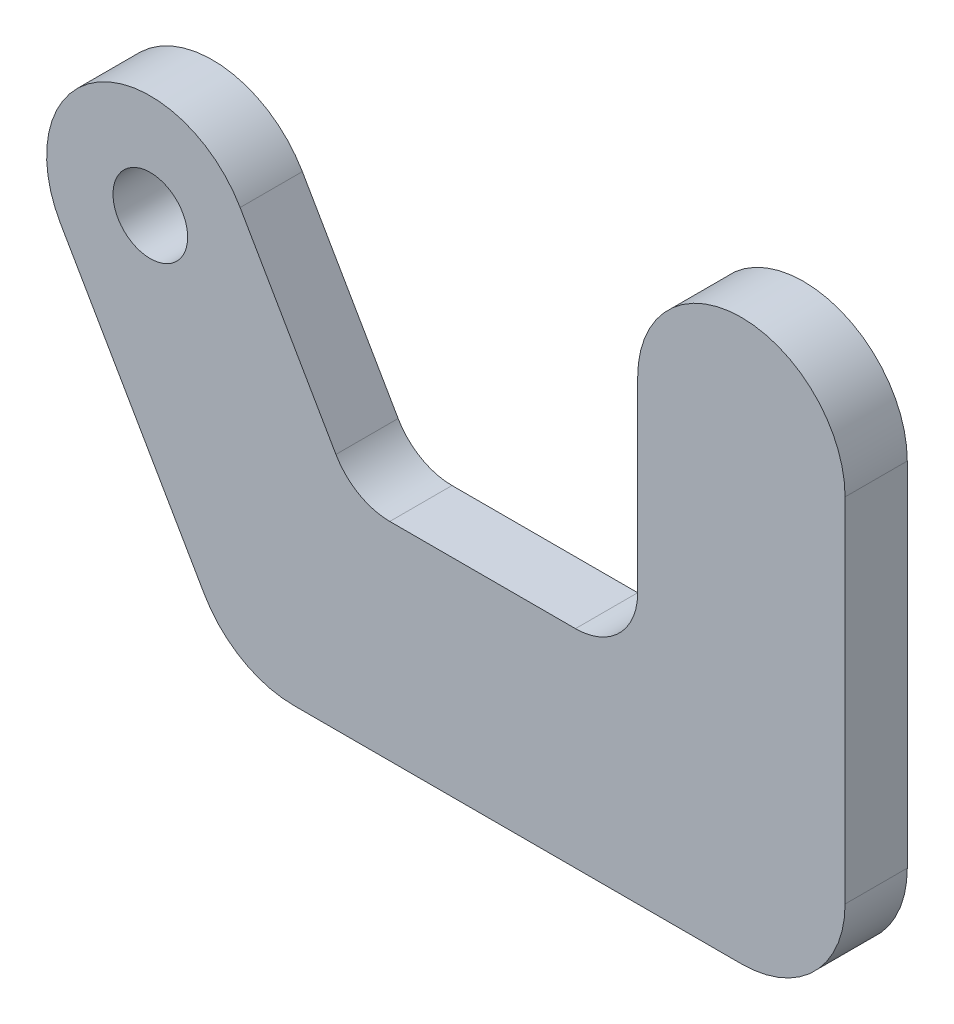
ISO-10303-21;
HEADER;
FILE_DESCRIPTION(('STEP AP214'),'2;1');
FILE_NAME('part.step','',(''),(''),'','','');
FILE_SCHEMA(('AUTOMOTIVE_DESIGN { 1 0 10303 214 1 1 1 1 }'));
ENDSEC;
DATA;
#1=APPLICATION_CONTEXT('core data for automotive mechanical design processes');
#2=APPLICATION_PROTOCOL_DEFINITION('international standard','automotive_design',2000,#1);
#3=PRODUCT_CONTEXT('',#1,'mechanical');
#4=PRODUCT('Part','Part','',(#3));
#5=PRODUCT_RELATED_PRODUCT_CATEGORY('part','',(#4));
#6=PRODUCT_DEFINITION_FORMATION('','',#4);
#7=PRODUCT_DEFINITION_CONTEXT('part definition',#1,'design');
#8=PRODUCT_DEFINITION('design','',#6,#7);
#9=PRODUCT_DEFINITION_SHAPE('','',#8);
#10=(LENGTH_UNIT() NAMED_UNIT(*) SI_UNIT(.MILLI.,.METRE.));
#11=(NAMED_UNIT(*) PLANE_ANGLE_UNIT() SI_UNIT($,.RADIAN.));
#12=(NAMED_UNIT(*) SI_UNIT($,.STERADIAN.) SOLID_ANGLE_UNIT());
#13=UNCERTAINTY_MEASURE_WITH_UNIT(LENGTH_MEASURE(1.E-05),#10,'distance_accuracy_value','');
#14=(GEOMETRIC_REPRESENTATION_CONTEXT(3) GLOBAL_UNCERTAINTY_ASSIGNED_CONTEXT((#13)) GLOBAL_UNIT_ASSIGNED_CONTEXT((#10,
#11,#12)) REPRESENTATION_CONTEXT('',''));
#15=CARTESIAN_POINT('',(0.,0.,0.));
#16=DIRECTION('',(0.,0.,1.));
#17=DIRECTION('',(1.,0.,0.));
#18=AXIS2_PLACEMENT_3D('',#15,#16,#17);
#19=CARTESIAN_POINT('',(4.3301270189222,2.49999999999999,3.));
#20=DIRECTION('',(0.86602540378444,0.499999999999998,0.));
#21=DIRECTION('',(-0.499999999999998,0.86602540378444,0.));
#22=AXIS2_PLACEMENT_3D('',#19,#20,#21);
#23=PLANE('',#22);
#24=DIRECTION('',(0.499999999999998,-0.86602540378444,0.));
#25=VECTOR('',#24,1.);
#26=CARTESIAN_POINT('',(4.3301270189222,2.49999999999999,3.));
#27=LINE('',#26,#25);
#28=CARTESIAN_POINT('',(4.3301270189222,2.49999999999999,3.));
#29=VERTEX_POINT('',#28);
#30=CARTESIAN_POINT('',(8.94892917243917,-5.5,3.));
#31=VERTEX_POINT('',#30);
#32=EDGE_CURVE('E126',#29,#31,#27,.T.);
#33=ORIENTED_EDGE('',*,*,#32,.T.);
#34=DIRECTION('',(0.,0.,-1.));
#35=VECTOR('',#34,1.);
#36=CARTESIAN_POINT('',(8.94892917243917,-5.49999999999999,0.));
#37=LINE('',#36,#35);
#38=CARTESIAN_POINT('',(8.94892917243917,-5.5,0.));
#39=VERTEX_POINT('',#38);
#40=EDGE_CURVE('E213',#31,#39,#37,.T.);
#41=ORIENTED_EDGE('',*,*,#40,.T.);
#42=DIRECTION('',(0.499999999999998,-0.86602540378444,0.));
#43=VECTOR('',#42,1.);
#44=CARTESIAN_POINT('',(4.3301270189222,2.49999999999999,0.));
#45=LINE('',#44,#43);
#46=CARTESIAN_POINT('',(4.3301270189222,2.49999999999999,0.));
#47=VERTEX_POINT('',#46);
#48=EDGE_CURVE('E129',#47,#39,#45,.T.);
#49=ORIENTED_EDGE('',*,*,#48,.F.);
#50=DIRECTION('',(0.,0.,-1.));
#51=VECTOR('',#50,1.);
#52=CARTESIAN_POINT('',(4.3301270189222,2.49999999999999,3.));
#53=LINE('',#52,#51);
#54=EDGE_CURVE('E122',#29,#47,#53,.T.);
#55=ORIENTED_EDGE('',*,*,#54,.F.);
#56=EDGE_LOOP('',(#33,#41,#49,#55));
#57=FACE_BOUND('',#56,.T.);
#58=ADVANCED_FACE('F35',(#57),#23,.T.);
#59=CARTESIAN_POINT('',(0.,0.,3.));
#60=DIRECTION('',(0.,0.,-1.));
#61=DIRECTION('',(-1.,0.,0.));
#62=AXIS2_PLACEMENT_3D('',#59,#60,#61);
#63=CYLINDRICAL_SURFACE('',#62,5.);
#64=CARTESIAN_POINT('',(0.,0.,0.));
#65=DIRECTION('',(0.,0.,1.));
#66=DIRECTION('',(1.,0.,0.));
#67=AXIS2_PLACEMENT_3D('',#64,#65,#66);
#68=CIRCLE('',#67,5.);
#69=CARTESIAN_POINT('',(-4.3301270189222,-2.49999999999999,0.));
#70=VERTEX_POINT('',#69);
#71=EDGE_CURVE('E174',#47,#70,#68,.T.);
#72=ORIENTED_EDGE('',*,*,#71,.T.);
#73=DIRECTION('',(0.,0.,-1.));
#74=VECTOR('',#73,1.);
#75=CARTESIAN_POINT('',(-4.3301270189222,-2.49999999999999,3.));
#76=LINE('',#75,#74);
#77=CARTESIAN_POINT('',(-4.3301270189222,-2.49999999999999,3.));
#78=VERTEX_POINT('',#77);
#79=EDGE_CURVE('E134',#78,#70,#76,.T.);
#80=ORIENTED_EDGE('',*,*,#79,.F.);
#81=CARTESIAN_POINT('',(0.,0.,3.));
#82=DIRECTION('',(0.,0.,1.));
#83=DIRECTION('',(1.,0.,0.));
#84=AXIS2_PLACEMENT_3D('',#81,#82,#83);
#85=CIRCLE('',#84,5.);
#86=EDGE_CURVE('E138',#29,#78,#85,.T.);
#87=ORIENTED_EDGE('',*,*,#86,.F.);
#88=ORIENTED_EDGE('',*,*,#54,.T.);
#89=EDGE_LOOP('',(#72,#80,#87,#88));
#90=FACE_BOUND('',#89,.T.);
#91=ADVANCED_FACE('F139',(#90),#63,.T.);
#92=CARTESIAN_POINT('',(-4.3301270189222,-2.49999999999999,3.));
#93=DIRECTION('',(0.86602540378444,0.499999999999998,0.));
#94=DIRECTION('',(-0.499999999999998,0.86602540378444,0.));
#95=AXIS2_PLACEMENT_3D('',#92,#93,#94);
#96=PLANE('',#95);
#97=DIRECTION('',(0.499999999999998,-0.86602540378444,0.));
#98=VECTOR('',#97,1.);
#99=CARTESIAN_POINT('',(-4.3301270189222,-2.49999999999999,0.));
#100=LINE('',#99,#98);
#101=CARTESIAN_POINT('',(2.59807621135327,-14.5,0.));
#102=VERTEX_POINT('',#101);
#103=EDGE_CURVE('E176',#70,#102,#100,.T.);
#104=ORIENTED_EDGE('',*,*,#103,.T.);
#105=DIRECTION('',(0.,0.,-1.));
#106=VECTOR('',#105,1.);
#107=CARTESIAN_POINT('',(2.59807621135327,-14.5,3.));
#108=LINE('',#107,#106);
#109=CARTESIAN_POINT('',(2.59807621135327,-14.5,3.));
#110=VERTEX_POINT('',#109);
#111=EDGE_CURVE('E211',#102,#110,#108,.F.);
#112=ORIENTED_EDGE('',*,*,#111,.T.);
#113=DIRECTION('',(0.499999999999998,-0.86602540378444,0.));
#114=VECTOR('',#113,1.);
#115=CARTESIAN_POINT('',(-4.3301270189222,-2.49999999999999,3.));
#116=LINE('',#115,#114);
#117=EDGE_CURVE('E143',#78,#110,#116,.T.);
#118=ORIENTED_EDGE('',*,*,#117,.F.);
#119=ORIENTED_EDGE('',*,*,#79,.T.);
#120=EDGE_LOOP('',(#104,#112,#118,#119));
#121=FACE_BOUND('',#120,.T.);
#122=ADVANCED_FACE('F247',(#121),#96,.F.);
#123=CARTESIAN_POINT('',(0.,-17.,3.));
#124=DIRECTION('',(0.,1.,0.));
#125=DIRECTION('',(0.,0.,1.));
#126=AXIS2_PLACEMENT_3D('',#123,#124,#125);
#127=PLANE('',#126);
#128=DIRECTION('',(1.,0.,0.));
#129=VECTOR('',#128,1.);
#130=CARTESIAN_POINT('',(0.,-17.,0.));
#131=LINE('',#130,#129);
#132=CARTESIAN_POINT('',(6.92820323027547,-17.,0.));
#133=VERTEX_POINT('',#132);
#134=CARTESIAN_POINT('',(28.5,-17.,0.));
#135=VERTEX_POINT('',#134);
#136=EDGE_CURVE('E179',#133,#135,#131,.T.);
#137=ORIENTED_EDGE('',*,*,#136,.T.);
#138=DIRECTION('',(0.,0.,-1.));
#139=VECTOR('',#138,1.);
#140=CARTESIAN_POINT('',(28.5,-17.,3.));
#141=LINE('',#140,#139);
#142=CARTESIAN_POINT('',(28.5,-17.,3.));
#143=VERTEX_POINT('',#142);
#144=EDGE_CURVE('E205',#135,#143,#141,.F.);
#145=ORIENTED_EDGE('',*,*,#144,.T.);
#146=DIRECTION('',(1.,0.,0.));
#147=VECTOR('',#146,1.);
#148=CARTESIAN_POINT('',(0.,-17.,3.));
#149=LINE('',#148,#147);
#150=CARTESIAN_POINT('',(6.92820323027547,-17.,3.));
#151=VERTEX_POINT('',#150);
#152=EDGE_CURVE('E157',#151,#143,#149,.T.);
#153=ORIENTED_EDGE('',*,*,#152,.F.);
#154=DIRECTION('',(0.,0.,-1.));
#155=VECTOR('',#154,1.);
#156=CARTESIAN_POINT('',(6.92820323027547,-17.,3.));
#157=LINE('',#156,#155);
#158=EDGE_CURVE('E202',#151,#133,#157,.T.);
#159=ORIENTED_EDGE('',*,*,#158,.T.);
#160=EDGE_LOOP('',(#137,#145,#153,#159));
#161=FACE_BOUND('',#160,.T.);
#162=ADVANCED_FACE('F279',(#161),#127,.F.);
#163=CARTESIAN_POINT('',(33.5,0.,3.));
#164=DIRECTION('',(-1.,0.,0.));
#165=DIRECTION('',(0.,0.,1.));
#166=AXIS2_PLACEMENT_3D('',#163,#164,#165);
#167=PLANE('',#166);
#168=DIRECTION('',(0.,1.,0.));
#169=VECTOR('',#168,1.);
#170=CARTESIAN_POINT('',(33.5,0.,3.));
#171=LINE('',#170,#169);
#172=CARTESIAN_POINT('',(33.5,-12.,3.));
#173=VERTEX_POINT('',#172);
#174=CARTESIAN_POINT('',(33.5,5.,3.));
#175=VERTEX_POINT('',#174);
#176=EDGE_CURVE('E159',#173,#175,#171,.T.);
#177=ORIENTED_EDGE('',*,*,#176,.F.);
#178=DIRECTION('',(0.,0.,-1.));
#179=VECTOR('',#178,1.);
#180=CARTESIAN_POINT('',(33.5,-12.,3.));
#181=LINE('',#180,#179);
#182=CARTESIAN_POINT('',(33.5,-12.,0.));
#183=VERTEX_POINT('',#182);
#184=EDGE_CURVE('E133',#173,#183,#181,.T.);
#185=ORIENTED_EDGE('',*,*,#184,.T.);
#186=DIRECTION('',(0.,1.,0.));
#187=VECTOR('',#186,1.);
#188=CARTESIAN_POINT('',(33.5,0.,0.));
#189=LINE('',#188,#187);
#190=CARTESIAN_POINT('',(33.5,5.,0.));
#191=VERTEX_POINT('',#190);
#192=EDGE_CURVE('E182',#183,#191,#189,.T.);
#193=ORIENTED_EDGE('',*,*,#192,.T.);
#194=DIRECTION('',(0.,0.,-1.));
#195=VECTOR('',#194,1.);
#196=CARTESIAN_POINT('',(33.5,5.,3.));
#197=LINE('',#196,#195);
#198=EDGE_CURVE('E192',#175,#191,#197,.T.);
#199=ORIENTED_EDGE('',*,*,#198,.F.);
#200=EDGE_LOOP('',(#177,#185,#193,#199));
#201=FACE_BOUND('',#200,.T.);
#202=ADVANCED_FACE('F271',(#201),#167,.F.);
#203=CARTESIAN_POINT('',(28.5,5.,3.));
#204=DIRECTION('',(0.,0.,-1.));
#205=DIRECTION('',(-1.,0.,0.));
#206=AXIS2_PLACEMENT_3D('',#203,#204,#205);
#207=CYLINDRICAL_SURFACE('',#206,5.);
#208=CARTESIAN_POINT('',(28.5,5.,0.));
#209=DIRECTION('',(0.,0.,1.));
#210=DIRECTION('',(1.,0.,0.));
#211=AXIS2_PLACEMENT_3D('',#208,#209,#210);
#212=CIRCLE('',#211,5.);
#213=CARTESIAN_POINT('',(23.5,5.,0.));
#214=VERTEX_POINT('',#213);
#215=EDGE_CURVE('E184',#191,#214,#212,.T.);
#216=ORIENTED_EDGE('',*,*,#215,.T.);
#217=DIRECTION('',(0.,0.,-1.));
#218=VECTOR('',#217,1.);
#219=CARTESIAN_POINT('',(23.5,5.,3.));
#220=LINE('',#219,#218);
#221=CARTESIAN_POINT('',(23.5,5.,3.));
#222=VERTEX_POINT('',#221);
#223=EDGE_CURVE('E169',#222,#214,#220,.T.);
#224=ORIENTED_EDGE('',*,*,#223,.F.);
#225=CARTESIAN_POINT('',(28.5,5.,3.));
#226=DIRECTION('',(0.,0.,1.));
#227=DIRECTION('',(1.,0.,0.));
#228=AXIS2_PLACEMENT_3D('',#225,#226,#227);
#229=CIRCLE('',#228,5.);
#230=EDGE_CURVE('E161',#175,#222,#229,.T.);
#231=ORIENTED_EDGE('',*,*,#230,.F.);
#232=ORIENTED_EDGE('',*,*,#198,.T.);
#233=EDGE_LOOP('',(#216,#224,#231,#232));
#234=FACE_BOUND('',#233,.T.);
#235=ADVANCED_FACE('F274',(#234),#207,.T.);
#236=CARTESIAN_POINT('',(23.5,0.,3.));
#237=DIRECTION('',(-1.,0.,0.));
#238=DIRECTION('',(0.,0.,1.));
#239=AXIS2_PLACEMENT_3D('',#236,#237,#238);
#240=PLANE('',#239);
#241=DIRECTION('',(0.,1.,0.));
#242=VECTOR('',#241,1.);
#243=CARTESIAN_POINT('',(23.5,0.,0.));
#244=LINE('',#243,#242);
#245=CARTESIAN_POINT('',(23.5,-4.,0.));
#246=VERTEX_POINT('',#245);
#247=EDGE_CURVE('E187',#246,#214,#244,.T.);
#248=ORIENTED_EDGE('',*,*,#247,.F.);
#249=DIRECTION('',(0.,0.,-1.));
#250=VECTOR('',#249,1.);
#251=CARTESIAN_POINT('',(23.5,-4.,3.));
#252=LINE('',#251,#250);
#253=CARTESIAN_POINT('',(23.5,-4.,3.));
#254=VERTEX_POINT('',#253);
#255=EDGE_CURVE('E50',#246,#254,#252,.F.);
#256=ORIENTED_EDGE('',*,*,#255,.T.);
#257=DIRECTION('',(0.,1.,0.));
#258=VECTOR('',#257,1.);
#259=CARTESIAN_POINT('',(23.5,0.,3.));
#260=LINE('',#259,#258);
#261=EDGE_CURVE('E164',#254,#222,#260,.T.);
#262=ORIENTED_EDGE('',*,*,#261,.T.);
#263=ORIENTED_EDGE('',*,*,#223,.T.);
#264=EDGE_LOOP('',(#248,#256,#262,#263));
#265=FACE_BOUND('',#264,.T.);
#266=ADVANCED_FACE('F254',(#265),#240,.T.);
#267=CARTESIAN_POINT('',(0.,0.,3.));
#268=DIRECTION('',(0.,0.,-1.));
#269=DIRECTION('',(-1.,0.,0.));
#270=AXIS2_PLACEMENT_3D('',#267,#268,#269);
#271=CYLINDRICAL_SURFACE('',#270,1.8);
#272=CARTESIAN_POINT('',(0.,0.,3.));
#273=DIRECTION('',(0.,0.,1.));
#274=DIRECTION('',(1.,0.,0.));
#275=AXIS2_PLACEMENT_3D('',#272,#273,#274);
#276=CIRCLE('',#275,1.8);
#277=CARTESIAN_POINT('',(1.8,0.,3.));
#278=VERTEX_POINT('',#277);
#279=EDGE_CURVE('E150',#278,#278,#276,.T.);
#280=ORIENTED_EDGE('',*,*,#279,.T.);
#281=EDGE_LOOP('',(#280));
#282=FACE_BOUND('',#281,.T.);
#283=CARTESIAN_POINT('',(0.,0.,0.));
#284=DIRECTION('',(0.,0.,1.));
#285=DIRECTION('',(1.,0.,0.));
#286=AXIS2_PLACEMENT_3D('',#283,#284,#285);
#287=CIRCLE('',#286,1.8);
#288=CARTESIAN_POINT('',(1.8,0.,0.));
#289=VERTEX_POINT('',#288);
#290=EDGE_CURVE('E170',#289,#289,#287,.T.);
#291=ORIENTED_EDGE('',*,*,#290,.F.);
#292=EDGE_LOOP('',(#291));
#293=FACE_BOUND('',#292,.T.);
#294=ADVANCED_FACE('F251',(#282,#293),#271,.F.);
#295=CARTESIAN_POINT('',(0.,-7.,3.));
#296=DIRECTION('',(0.,1.,0.));
#297=DIRECTION('',(0.,0.,1.));
#298=AXIS2_PLACEMENT_3D('',#295,#296,#297);
#299=PLANE('',#298);
#300=DIRECTION('',(1.,0.,0.));
#301=VECTOR('',#300,1.);
#302=CARTESIAN_POINT('',(0.,-7.,0.));
#303=LINE('',#302,#301);
#304=CARTESIAN_POINT('',(11.5470053837925,-7.,0.));
#305=VERTEX_POINT('',#304);
#306=CARTESIAN_POINT('',(20.5,-7.,0.));
#307=VERTEX_POINT('',#306);
#308=EDGE_CURVE('E153',#305,#307,#303,.T.);
#309=ORIENTED_EDGE('',*,*,#308,.F.);
#310=DIRECTION('',(0.,0.,-1.));
#311=VECTOR('',#310,1.);
#312=CARTESIAN_POINT('',(11.5470053837925,-7.,3.));
#313=LINE('',#312,#311);
#314=CARTESIAN_POINT('',(11.5470053837925,-7.,3.));
#315=VERTEX_POINT('',#314);
#316=EDGE_CURVE('E218',#305,#315,#313,.F.);
#317=ORIENTED_EDGE('',*,*,#316,.T.);
#318=DIRECTION('',(1.,0.,0.));
#319=VECTOR('',#318,1.);
#320=CARTESIAN_POINT('',(0.,-7.,3.));
#321=LINE('',#320,#319);
#322=CARTESIAN_POINT('',(20.5,-7.,3.));
#323=VERTEX_POINT('',#322);
#324=EDGE_CURVE('E166',#315,#323,#321,.T.);
#325=ORIENTED_EDGE('',*,*,#324,.T.);
#326=DIRECTION('',(0.,0.,-1.));
#327=VECTOR('',#326,1.);
#328=CARTESIAN_POINT('',(20.5,-7.,0.));
#329=LINE('',#328,#327);
#330=EDGE_CURVE('E215',#323,#307,#329,.T.);
#331=ORIENTED_EDGE('',*,*,#330,.T.);
#332=EDGE_LOOP('',(#309,#317,#325,#331));
#333=FACE_BOUND('',#332,.T.);
#334=ADVANCED_FACE('F229',(#333),#299,.T.);
#335=CARTESIAN_POINT('',(0.,0.,3.));
#336=DIRECTION('',(0.,0.,1.));
#337=DIRECTION('',(1.,0.,0.));
#338=AXIS2_PLACEMENT_3D('',#335,#336,#337);
#339=PLANE('',#338);
#340=ORIENTED_EDGE('',*,*,#279,.F.);
#341=EDGE_LOOP('',(#340));
#342=FACE_BOUND('',#341,.T.);
#343=ORIENTED_EDGE('',*,*,#152,.T.);
#344=CARTESIAN_POINT('',(28.5,-12.,3.));
#345=DIRECTION('',(0.,0.,1.));
#346=DIRECTION('',(1.,0.,0.));
#347=AXIS2_PLACEMENT_3D('',#344,#345,#346);
#348=CIRCLE('',#347,5.);
#349=EDGE_CURVE('E209',#143,#173,#348,.T.);
#350=ORIENTED_EDGE('',*,*,#349,.T.);
#351=ORIENTED_EDGE('',*,*,#176,.T.);
#352=ORIENTED_EDGE('',*,*,#230,.T.);
#353=ORIENTED_EDGE('',*,*,#261,.F.);
#354=CARTESIAN_POINT('',(20.5,-4.,3.));
#355=DIRECTION('',(0.,0.,1.));
#356=DIRECTION('',(1.,0.,0.));
#357=AXIS2_PLACEMENT_3D('',#354,#355,#356);
#358=CIRCLE('',#357,3.);
#359=EDGE_CURVE('E11',#254,#323,#358,.F.);
#360=ORIENTED_EDGE('',*,*,#359,.T.);
#361=ORIENTED_EDGE('',*,*,#324,.F.);
#362=CARTESIAN_POINT('',(11.5470053837925,-4.,3.));
#363=DIRECTION('',(0.,0.,1.));
#364=DIRECTION('',(1.,0.,0.));
#365=AXIS2_PLACEMENT_3D('',#362,#363,#364);
#366=CIRCLE('',#365,3.);
#367=EDGE_CURVE('E149',#315,#31,#366,.F.);
#368=ORIENTED_EDGE('',*,*,#367,.T.);
#369=ORIENTED_EDGE('',*,*,#32,.F.);
#370=ORIENTED_EDGE('',*,*,#86,.T.);
#371=ORIENTED_EDGE('',*,*,#117,.T.);
#372=CARTESIAN_POINT('',(6.92820323027547,-12.,3.));
#373=DIRECTION('',(0.,0.,1.));
#374=DIRECTION('',(1.,0.,0.));
#375=AXIS2_PLACEMENT_3D('',#372,#373,#374);
#376=CIRCLE('',#375,5.);
#377=EDGE_CURVE('E207',#110,#151,#376,.T.);
#378=ORIENTED_EDGE('',*,*,#377,.T.);
#379=EDGE_LOOP('',(#343,#350,#351,#352,#353,#360,#361,#368,#369,#370,#371,#378));
#380=FACE_BOUND('',#379,.T.);
#381=ADVANCED_FACE('F146',(#342,#380),#339,.T.);
#382=CARTESIAN_POINT('',(0.,0.,0.));
#383=DIRECTION('',(0.,0.,1.));
#384=DIRECTION('',(1.,0.,0.));
#385=AXIS2_PLACEMENT_3D('',#382,#383,#384);
#386=PLANE('',#385);
#387=ORIENTED_EDGE('',*,*,#290,.T.);
#388=EDGE_LOOP('',(#387));
#389=FACE_BOUND('',#388,.T.);
#390=ORIENTED_EDGE('',*,*,#192,.F.);
#391=CARTESIAN_POINT('',(28.5,-12.,0.));
#392=DIRECTION('',(0.,0.,1.));
#393=DIRECTION('',(1.,0.,0.));
#394=AXIS2_PLACEMENT_3D('',#391,#392,#393);
#395=CIRCLE('',#394,5.);
#396=EDGE_CURVE('E200',#183,#135,#395,.F.);
#397=ORIENTED_EDGE('',*,*,#396,.T.);
#398=ORIENTED_EDGE('',*,*,#136,.F.);
#399=CARTESIAN_POINT('',(6.92820323027547,-12.,0.));
#400=DIRECTION('',(0.,0.,1.));
#401=DIRECTION('',(1.,0.,0.));
#402=AXIS2_PLACEMENT_3D('',#399,#400,#401);
#403=CIRCLE('',#402,5.);
#404=EDGE_CURVE('E198',#133,#102,#403,.F.);
#405=ORIENTED_EDGE('',*,*,#404,.T.);
#406=ORIENTED_EDGE('',*,*,#103,.F.);
#407=ORIENTED_EDGE('',*,*,#71,.F.);
#408=ORIENTED_EDGE('',*,*,#48,.T.);
#409=CARTESIAN_POINT('',(11.5470053837925,-4.,0.));
#410=DIRECTION('',(0.,0.,1.));
#411=DIRECTION('',(1.,0.,0.));
#412=AXIS2_PLACEMENT_3D('',#409,#410,#411);
#413=CIRCLE('',#412,3.);
#414=EDGE_CURVE('E221',#39,#305,#413,.T.);
#415=ORIENTED_EDGE('',*,*,#414,.T.);
#416=ORIENTED_EDGE('',*,*,#308,.T.);
#417=CARTESIAN_POINT('',(20.5,-4.,0.));
#418=DIRECTION('',(0.,0.,1.));
#419=DIRECTION('',(1.,0.,0.));
#420=AXIS2_PLACEMENT_3D('',#417,#418,#419);
#421=CIRCLE('',#420,3.);
#422=EDGE_CURVE('E43',#307,#246,#421,.T.);
#423=ORIENTED_EDGE('',*,*,#422,.T.);
#424=ORIENTED_EDGE('',*,*,#247,.T.);
#425=ORIENTED_EDGE('',*,*,#215,.F.);
#426=EDGE_LOOP('',(#390,#397,#398,#405,#406,#407,#408,#415,#416,#423,#424,#425));
#427=FACE_BOUND('',#426,.T.);
#428=ADVANCED_FACE('F225',(#389,#427),#386,.F.);
#429=CARTESIAN_POINT('',(28.5,-12.,3.));
#430=DIRECTION('',(0.,0.,-1.));
#431=DIRECTION('',(-1.,0.,0.));
#432=AXIS2_PLACEMENT_3D('',#429,#430,#431);
#433=CYLINDRICAL_SURFACE('',#432,5.);
#434=ORIENTED_EDGE('',*,*,#349,.F.);
#435=ORIENTED_EDGE('',*,*,#144,.F.);
#436=ORIENTED_EDGE('',*,*,#396,.F.);
#437=ORIENTED_EDGE('',*,*,#184,.F.);
#438=EDGE_LOOP('',(#434,#435,#436,#437));
#439=FACE_BOUND('',#438,.T.);
#440=ADVANCED_FACE('F239',(#439),#433,.T.);
#441=CARTESIAN_POINT('',(6.92820323027547,-12.,3.));
#442=DIRECTION('',(0.,0.,-1.));
#443=DIRECTION('',(-1.,0.,0.));
#444=AXIS2_PLACEMENT_3D('',#441,#442,#443);
#445=CYLINDRICAL_SURFACE('',#444,5.);
#446=ORIENTED_EDGE('',*,*,#377,.F.);
#447=ORIENTED_EDGE('',*,*,#111,.F.);
#448=ORIENTED_EDGE('',*,*,#404,.F.);
#449=ORIENTED_EDGE('',*,*,#158,.F.);
#450=EDGE_LOOP('',(#446,#447,#448,#449));
#451=FACE_BOUND('',#450,.T.);
#452=ADVANCED_FACE('F233',(#451),#445,.T.);
#453=CARTESIAN_POINT('',(11.5470053837925,-4.,3.));
#454=DIRECTION('',(0.,0.,1.));
#455=DIRECTION('',(1.,0.,0.));
#456=AXIS2_PLACEMENT_3D('',#453,#454,#455);
#457=CYLINDRICAL_SURFACE('',#456,3.);
#458=ORIENTED_EDGE('',*,*,#367,.F.);
#459=ORIENTED_EDGE('',*,*,#316,.F.);
#460=ORIENTED_EDGE('',*,*,#414,.F.);
#461=ORIENTED_EDGE('',*,*,#40,.F.);
#462=EDGE_LOOP('',(#458,#459,#460,#461));
#463=FACE_BOUND('',#462,.T.);
#464=ADVANCED_FACE('F231',(#463),#457,.F.);
#465=CARTESIAN_POINT('',(20.5,-4.,3.));
#466=DIRECTION('',(0.,0.,1.));
#467=DIRECTION('',(1.,0.,0.));
#468=AXIS2_PLACEMENT_3D('',#465,#466,#467);
#469=CYLINDRICAL_SURFACE('',#468,3.);
#470=ORIENTED_EDGE('',*,*,#359,.F.);
#471=ORIENTED_EDGE('',*,*,#255,.F.);
#472=ORIENTED_EDGE('',*,*,#422,.F.);
#473=ORIENTED_EDGE('',*,*,#330,.F.);
#474=EDGE_LOOP('',(#470,#471,#472,#473));
#475=FACE_BOUND('',#474,.T.);
#476=ADVANCED_FACE('F37',(#475),#469,.F.);
#477=CLOSED_SHELL('',(#58,#91,#122,#162,#202,#235,#266,#294,#334,#381,#428,#440,#452,#464,#476));
#478=MANIFOLD_SOLID_BREP('B2',#477);
#479=ADVANCED_BREP_SHAPE_REPRESENTATION('',(#18,#478),#14);
#480=SHAPE_DEFINITION_REPRESENTATION(#9,#479);
ENDSEC;
END-ISO-10303-21;
